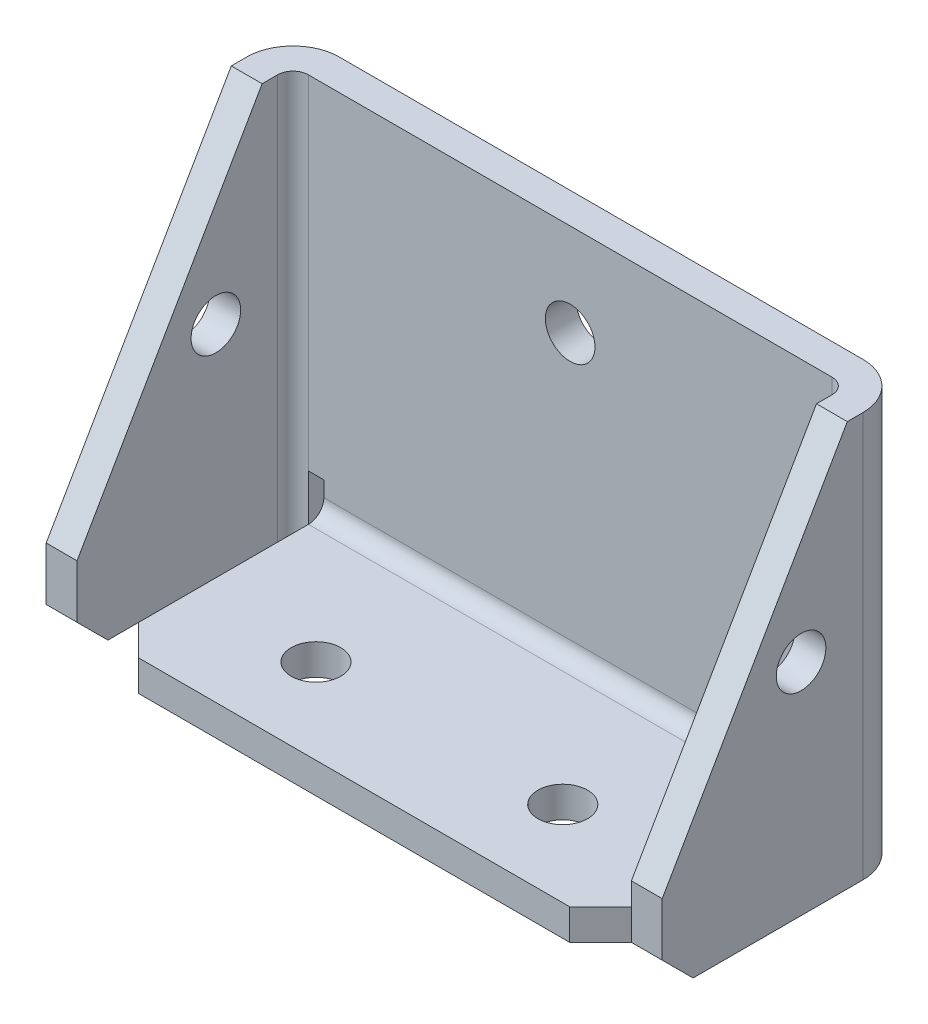
ISO-10303-21;
HEADER;
FILE_DESCRIPTION(('STEP AP214'),'2;1');
FILE_NAME('part.step','',(''),(''),'','','');
FILE_SCHEMA(('AUTOMOTIVE_DESIGN { 1 0 10303 214 1 1 1 1 }'));
ENDSEC;
DATA;
#1=APPLICATION_CONTEXT('core data for automotive mechanical design processes');
#2=APPLICATION_PROTOCOL_DEFINITION('international standard','automotive_design',2000,#1);
#3=PRODUCT_CONTEXT('',#1,'mechanical');
#4=PRODUCT('Part','Part','',(#3));
#5=PRODUCT_RELATED_PRODUCT_CATEGORY('part','',(#4));
#6=PRODUCT_DEFINITION_FORMATION('','',#4);
#7=PRODUCT_DEFINITION_CONTEXT('part definition',#1,'design');
#8=PRODUCT_DEFINITION('design','',#6,#7);
#9=PRODUCT_DEFINITION_SHAPE('','',#8);
#10=(LENGTH_UNIT() NAMED_UNIT(*) SI_UNIT(.MILLI.,.METRE.));
#11=(NAMED_UNIT(*) PLANE_ANGLE_UNIT() SI_UNIT($,.RADIAN.));
#12=(NAMED_UNIT(*) SI_UNIT($,.STERADIAN.) SOLID_ANGLE_UNIT());
#13=UNCERTAINTY_MEASURE_WITH_UNIT(LENGTH_MEASURE(1.E-05),#10,'distance_accuracy_value','');
#14=(GEOMETRIC_REPRESENTATION_CONTEXT(3) GLOBAL_UNCERTAINTY_ASSIGNED_CONTEXT((#13)) GLOBAL_UNIT_ASSIGNED_CONTEXT((#10,
#11,#12)) REPRESENTATION_CONTEXT('',''));
#15=CARTESIAN_POINT('',(0.,0.,0.));
#16=DIRECTION('',(0.,0.,1.));
#17=DIRECTION('',(1.,0.,0.));
#18=AXIS2_PLACEMENT_3D('',#15,#16,#17);
#19=CARTESIAN_POINT('',(0.,0.,0.));
#20=DIRECTION('',(0.,0.,1.));
#21=DIRECTION('',(1.,0.,0.));
#22=AXIS2_PLACEMENT_3D('',#19,#20,#21);
#23=PLANE('',#22);
#24=CARTESIAN_POINT('',(26.938605,32.131,0.));
#25=DIRECTION('',(0.,0.,1.));
#26=DIRECTION('',(1.,0.,0.));
#27=AXIS2_PLACEMENT_3D('',#24,#25,#26);
#28=CIRCLE('',#27,2.55269999999999);
#29=CARTESIAN_POINT('',(29.491305,32.131,0.));
#30=VERTEX_POINT('',#29);
#31=EDGE_CURVE('E520',#30,#30,#28,.T.);
#32=ORIENTED_EDGE('',*,*,#31,.F.);
#33=EDGE_LOOP('',(#32));
#34=FACE_BOUND('',#33,.T.);
#35=DIRECTION('',(-1.,0.,0.));
#36=VECTOR('',#35,1.);
#37=CARTESIAN_POINT('',(55.46471,41.656,0.));
#38=LINE('',#37,#36);
#39=CARTESIAN_POINT('',(53.87721,41.656,0.));
#40=VERTEX_POINT('',#39);
#41=CARTESIAN_POINT('',(0.,41.656,0.));
#42=VERTEX_POINT('',#41);
#43=EDGE_CURVE('E315',#40,#42,#38,.T.);
#44=ORIENTED_EDGE('',*,*,#43,.T.);
#45=DIRECTION('',(0.,-1.,0.));
#46=VECTOR('',#45,1.);
#47=CARTESIAN_POINT('',(0.,0.,0.));
#48=LINE('',#47,#46);
#49=CARTESIAN_POINT('',(0.,6.35,0.));
#50=VERTEX_POINT('',#49);
#51=EDGE_CURVE('E395',#42,#50,#48,.T.);
#52=ORIENTED_EDGE('',*,*,#51,.T.);
#53=DIRECTION('',(1.,0.,0.));
#54=VECTOR('',#53,1.);
#55=CARTESIAN_POINT('',(0.,6.35,0.));
#56=LINE('',#55,#54);
#57=CARTESIAN_POINT('',(1.5875,6.35,0.));
#58=VERTEX_POINT('',#57);
#59=EDGE_CURVE('E274',#50,#58,#56,.T.);
#60=ORIENTED_EDGE('',*,*,#59,.T.);
#61=DIRECTION('',(0.,-1.,0.));
#62=VECTOR('',#61,1.);
#63=CARTESIAN_POINT('',(1.5875,6.35,0.));
#64=LINE('',#63,#62);
#65=CARTESIAN_POINT('',(1.5875,4.7625,0.));
#66=VERTEX_POINT('',#65);
#67=EDGE_CURVE('E277',#58,#66,#64,.T.);
#68=ORIENTED_EDGE('',*,*,#67,.T.);
#69=DIRECTION('',(-1.,0.,0.));
#70=VECTOR('',#69,1.);
#71=CARTESIAN_POINT('',(0.,4.7625,0.));
#72=LINE('',#71,#70);
#73=CARTESIAN_POINT('',(52.28971,4.7625,0.));
#74=VERTEX_POINT('',#73);
#75=EDGE_CURVE('E459',#66,#74,#72,.F.);
#76=ORIENTED_EDGE('',*,*,#75,.T.);
#77=DIRECTION('',(0.,1.,0.));
#78=VECTOR('',#77,1.);
#79=CARTESIAN_POINT('',(52.28971,0.,0.));
#80=LINE('',#79,#78);
#81=CARTESIAN_POINT('',(52.28971,6.35,0.));
#82=VERTEX_POINT('',#81);
#83=EDGE_CURVE('E258',#74,#82,#80,.T.);
#84=ORIENTED_EDGE('',*,*,#83,.T.);
#85=DIRECTION('',(1.,0.,0.));
#86=VECTOR('',#85,1.);
#87=CARTESIAN_POINT('',(52.28971,6.35,0.));
#88=LINE('',#87,#86);
#89=CARTESIAN_POINT('',(53.87721,6.35,0.));
#90=VERTEX_POINT('',#89);
#91=EDGE_CURVE('E253',#82,#90,#88,.T.);
#92=ORIENTED_EDGE('',*,*,#91,.T.);
#93=DIRECTION('',(0.,1.,0.));
#94=VECTOR('',#93,1.);
#95=CARTESIAN_POINT('',(53.87721,41.656,0.));
#96=LINE('',#95,#94);
#97=EDGE_CURVE('E252',#90,#40,#96,.T.);
#98=ORIENTED_EDGE('',*,*,#97,.T.);
#99=EDGE_LOOP('',(#44,#52,#60,#68,#76,#84,#92,#98));
#100=FACE_BOUND('',#99,.T.);
#101=ADVANCED_FACE('F40',(#34,#100),#23,.T.);
#102=CARTESIAN_POINT('',(0.,0.,0.));
#103=DIRECTION('',(0.,-1.,0.));
#104=DIRECTION('',(0.,0.,-1.));
#105=AXIS2_PLACEMENT_3D('',#102,#103,#104);
#106=PLANE('',#105);
#107=DIRECTION('',(0.,0.,-1.));
#108=VECTOR('',#107,1.);
#109=CARTESIAN_POINT('',(53.87721,0.,22.226025));
#110=LINE('',#109,#108);
#111=CARTESIAN_POINT('',(53.87721,0.,0.));
#112=VERTEX_POINT('',#111);
#113=CARTESIAN_POINT('',(53.87721,0.,-3.175));
#114=VERTEX_POINT('',#113);
#115=EDGE_CURVE('E229',#112,#114,#110,.T.);
#116=ORIENTED_EDGE('',*,*,#115,.T.);
#117=CARTESIAN_POINT('',(53.87721,0.,1.5875));
#118=DIRECTION('',(0.,-1.,0.));
#119=DIRECTION('',(0.,0.,-1.));
#120=AXIS2_PLACEMENT_3D('',#117,#118,#119);
#121=CIRCLE('',#120,4.7625);
#122=CARTESIAN_POINT('',(58.63971,0.,1.58749999999999));
#123=VERTEX_POINT('',#122);
#124=EDGE_CURVE('E368',#114,#123,#121,.T.);
#125=ORIENTED_EDGE('',*,*,#124,.T.);
#126=DIRECTION('',(0.,0.,1.));
#127=VECTOR('',#126,1.);
#128=CARTESIAN_POINT('',(58.6397100000001,0.,22.225));
#129=LINE('',#128,#127);
#130=CARTESIAN_POINT('',(58.6397100000001,0.,19.05));
#131=VERTEX_POINT('',#130);
#132=EDGE_CURVE('E304',#123,#131,#129,.T.);
#133=ORIENTED_EDGE('',*,*,#132,.T.);
#134=DIRECTION('',(-1.,0.,0.));
#135=VECTOR('',#134,1.);
#136=CARTESIAN_POINT('',(55.4647100000001,0.,19.05));
#137=LINE('',#136,#135);
#138=CARTESIAN_POINT('',(55.46471,0.,19.05));
#139=VERTEX_POINT('',#138);
#140=EDGE_CURVE('E378',#131,#139,#137,.T.);
#141=ORIENTED_EDGE('',*,*,#140,.T.);
#142=DIRECTION('',(0.,0.,-1.));
#143=VECTOR('',#142,1.);
#144=CARTESIAN_POINT('',(55.46471,0.,0.));
#145=LINE('',#144,#143);
#146=CARTESIAN_POINT('',(55.46471,0.,1.58749999999999));
#147=VERTEX_POINT('',#146);
#148=EDGE_CURVE('E233',#139,#147,#145,.T.);
#149=ORIENTED_EDGE('',*,*,#148,.T.);
#150=CARTESIAN_POINT('',(53.87721,0.,1.5875));
#151=DIRECTION('',(0.,-1.,0.));
#152=DIRECTION('',(0.,0.,-1.));
#153=AXIS2_PLACEMENT_3D('',#150,#151,#152);
#154=CIRCLE('',#153,1.5875);
#155=EDGE_CURVE('E226',#147,#112,#154,.F.);
#156=ORIENTED_EDGE('',*,*,#155,.T.);
#157=EDGE_LOOP('',(#116,#125,#133,#141,#149,#156));
#158=FACE_BOUND('',#157,.T.);
#159=ADVANCED_FACE('F228',(#158),#106,.T.);
#160=CARTESIAN_POINT('',(14.238605,0.,13.462));
#161=DIRECTION('',(0.,1.,0.));
#162=DIRECTION('',(0.,0.,1.));
#163=AXIS2_PLACEMENT_3D('',#160,#161,#162);
#164=CIRCLE('',#163,2.55269999999998);
#165=CARTESIAN_POINT('',(14.238605,0.,16.0147));
#166=VERTEX_POINT('',#165);
#167=EDGE_CURVE('E1258',#166,#166,#164,.T.);
#168=ORIENTED_EDGE('',*,*,#167,.T.);
#169=EDGE_LOOP('',(#168));
#170=FACE_BOUND('',#169,.T.);
#171=CARTESIAN_POINT('',(39.638605,0.,13.462));
#172=DIRECTION('',(0.,1.,0.));
#173=DIRECTION('',(0.,0.,1.));
#174=AXIS2_PLACEMENT_3D('',#171,#172,#173);
#175=CIRCLE('',#174,2.55269999999998);
#176=CARTESIAN_POINT('',(39.638605,0.,16.0147));
#177=VERTEX_POINT('',#176);
#178=EDGE_CURVE('E1252',#177,#177,#175,.T.);
#179=ORIENTED_EDGE('',*,*,#178,.T.);
#180=EDGE_LOOP('',(#179));
#181=FACE_BOUND('',#180,.T.);
#182=DIRECTION('',(0.,0.,-1.));
#183=VECTOR('',#182,1.);
#184=CARTESIAN_POINT('',(1.5875,0.,22.226025));
#185=LINE('',#184,#183);
#186=CARTESIAN_POINT('',(1.5875,0.,19.05));
#187=VERTEX_POINT('',#186);
#188=CARTESIAN_POINT('',(1.5875,0.,1.58750000000001));
#189=VERTEX_POINT('',#188);
#190=EDGE_CURVE('E289',#187,#189,#185,.T.);
#191=ORIENTED_EDGE('',*,*,#190,.T.);
#192=DIRECTION('',(1.,0.,0.));
#193=VECTOR('',#192,1.);
#194=CARTESIAN_POINT('',(0.,0.,1.5875));
#195=LINE('',#194,#193);
#196=CARTESIAN_POINT('',(52.28971,0.,1.58750000000001));
#197=VERTEX_POINT('',#196);
#198=EDGE_CURVE('E407',#189,#197,#195,.T.);
#199=ORIENTED_EDGE('',*,*,#198,.T.);
#200=DIRECTION('',(0.,0.,-1.));
#201=VECTOR('',#200,1.);
#202=CARTESIAN_POINT('',(52.28971,0.,22.226025));
#203=LINE('',#202,#201);
#204=CARTESIAN_POINT('',(52.28971,0.,19.0499999999999));
#205=VERTEX_POINT('',#204);
#206=EDGE_CURVE('E247',#205,#197,#203,.T.);
#207=ORIENTED_EDGE('',*,*,#206,.F.);
#208=DIRECTION('',(0.707106781186544,0.,-0.707106781186551));
#209=VECTOR('',#208,1.);
#210=CARTESIAN_POINT('',(35.6698550000003,0.,35.6698549999999));
#211=LINE('',#210,#209);
#212=CARTESIAN_POINT('',(49.11471,0.,22.225));
#213=VERTEX_POINT('',#212);
#214=EDGE_CURVE('E433',#205,#213,#211,.F.);
#215=ORIENTED_EDGE('',*,*,#214,.T.);
#216=DIRECTION('',(1.,0.,0.));
#217=VECTOR('',#216,1.);
#218=CARTESIAN_POINT('',(52.28971,0.,22.225));
#219=LINE('',#218,#217);
#220=CARTESIAN_POINT('',(4.7625,0.,22.225));
#221=VERTEX_POINT('',#220);
#222=EDGE_CURVE('E428',#221,#213,#219,.T.);
#223=ORIENTED_EDGE('',*,*,#222,.F.);
#224=DIRECTION('',(0.707106781186544,0.,0.707106781186551));
#225=VECTOR('',#224,1.);
#226=CARTESIAN_POINT('',(-8.73124999999998,0.,8.7312499999999));
#227=LINE('',#226,#225);
#228=EDGE_CURVE('E426',#221,#187,#227,.F.);
#229=ORIENTED_EDGE('',*,*,#228,.T.);
#230=EDGE_LOOP('',(#191,#199,#207,#215,#223,#229));
#231=FACE_BOUND('',#230,.T.);
#232=ADVANCED_FACE('F424',(#170,#181,#231),#106,.T.);
#233=CARTESIAN_POINT('',(-1.58749999999999,0.,0.));
#234=DIRECTION('',(1.,0.,0.));
#235=DIRECTION('',(0.,0.,-1.));
#236=AXIS2_PLACEMENT_3D('',#233,#234,#235);
#237=PLANE('',#236);
#238=CARTESIAN_POINT('',(-1.58750000000002,22.606,7.93750000000019));
#239=DIRECTION('',(1.,0.,0.));
#240=DIRECTION('',(0.,0.,-1.));
#241=AXIS2_PLACEMENT_3D('',#238,#239,#240);
#242=CIRCLE('',#241,2.55269999999999);
#243=CARTESIAN_POINT('',(-1.58750000000001,22.606,5.38480000000019));
#244=VERTEX_POINT('',#243);
#245=EDGE_CURVE('E528',#244,#244,#242,.T.);
#246=ORIENTED_EDGE('',*,*,#245,.F.);
#247=EDGE_LOOP('',(#246));
#248=FACE_BOUND('',#247,.T.);
#249=DIRECTION('',(0.,0.,1.));
#250=VECTOR('',#249,1.);
#251=CARTESIAN_POINT('',(-1.58750000000007,0.,22.225));
#252=LINE('',#251,#250);
#253=CARTESIAN_POINT('',(-1.5875,0.,1.5875));
#254=VERTEX_POINT('',#253);
#255=CARTESIAN_POINT('',(-1.58750000000006,0.,19.05));
#256=VERTEX_POINT('',#255);
#257=EDGE_CURVE('E292',#254,#256,#252,.T.);
#258=ORIENTED_EDGE('',*,*,#257,.F.);
#259=DIRECTION('',(0.,-1.,0.));
#260=VECTOR('',#259,1.);
#261=CARTESIAN_POINT('',(-1.5875,41.656,1.58749999999999));
#262=LINE('',#261,#260);
#263=CARTESIAN_POINT('',(-1.58749999999999,41.656,1.58749999999999));
#264=VERTEX_POINT('',#263);
#265=EDGE_CURVE('E390',#254,#264,#262,.F.);
#266=ORIENTED_EDGE('',*,*,#265,.T.);
#267=DIRECTION('',(0.,0.,1.));
#268=VECTOR('',#267,1.);
#269=CARTESIAN_POINT('',(-1.58749999999999,41.656,0.));
#270=LINE('',#269,#268);
#271=CARTESIAN_POINT('',(-1.58749999999999,41.656,3.17499999999995));
#272=VERTEX_POINT('',#271);
#273=EDGE_CURVE('E319',#264,#272,#270,.T.);
#274=ORIENTED_EDGE('',*,*,#273,.T.);
#275=DIRECTION('',(0.,0.866025403784438,-0.500000000000001));
#276=VECTOR('',#275,1.);
#277=CARTESIAN_POINT('',(-1.58750000000001,41.656,3.17499999999996));
#278=LINE('',#277,#276);
#279=CARTESIAN_POINT('',(-1.58750000000007,8.66043211581293,22.225));
#280=VERTEX_POINT('',#279);
#281=EDGE_CURVE('E321',#272,#280,#278,.F.);
#282=ORIENTED_EDGE('',*,*,#281,.T.);
#283=DIRECTION('',(0.,1.,0.));
#284=VECTOR('',#283,1.);
#285=CARTESIAN_POINT('',(-1.58750000000007,0.,22.225));
#286=LINE('',#285,#284);
#287=CARTESIAN_POINT('',(-1.58750000000007,3.17500000000003,22.225));
#288=VERTEX_POINT('',#287);
#289=EDGE_CURVE('E313',#288,#280,#286,.T.);
#290=ORIENTED_EDGE('',*,*,#289,.F.);
#291=DIRECTION('',(0.,-0.707106781186552,-0.707106781186544));
#292=VECTOR('',#291,1.);
#293=CARTESIAN_POINT('',(-1.58750000000003,-9.525,9.52500000000011));
#294=LINE('',#293,#292);
#295=EDGE_CURVE('E381',#288,#256,#294,.T.);
#296=ORIENTED_EDGE('',*,*,#295,.T.);
#297=EDGE_LOOP('',(#258,#266,#274,#282,#290,#296));
#298=FACE_BOUND('',#297,.T.);
#299=ADVANCED_FACE('F499',(#248,#298),#237,.T.);
#300=CARTESIAN_POINT('',(55.46471,0.,-1.85031751825144E-13));
#301=DIRECTION('',(-1.,0.,0.));
#302=DIRECTION('',(0.,0.,1.));
#303=AXIS2_PLACEMENT_3D('',#300,#301,#302);
#304=PLANE('',#303);
#305=CARTESIAN_POINT('',(55.46471,22.606,7.93749999999999));
#306=DIRECTION('',(-1.,0.,0.));
#307=DIRECTION('',(0.,0.,1.));
#308=AXIS2_PLACEMENT_3D('',#305,#306,#307);
#309=CIRCLE('',#308,2.5527);
#310=CARTESIAN_POINT('',(55.46471,22.606,10.4902));
#311=VERTEX_POINT('',#310);
#312=EDGE_CURVE('E1243',#311,#311,#309,.T.);
#313=ORIENTED_EDGE('',*,*,#312,.F.);
#314=EDGE_LOOP('',(#313));
#315=FACE_BOUND('',#314,.T.);
#316=DIRECTION('',(0.,0.,1.));
#317=VECTOR('',#316,1.);
#318=CARTESIAN_POINT('',(55.46471,41.656,0.));
#319=LINE('',#318,#317);
#320=CARTESIAN_POINT('',(55.46471,41.656,1.58749999999999));
#321=VERTEX_POINT('',#320);
#322=CARTESIAN_POINT('',(55.46471,41.656,3.17499999999995));
#323=VERTEX_POINT('',#322);
#324=EDGE_CURVE('E318',#321,#323,#319,.T.);
#325=ORIENTED_EDGE('',*,*,#324,.F.);
#326=DIRECTION('',(0.,1.,0.));
#327=VECTOR('',#326,1.);
#328=CARTESIAN_POINT('',(55.46471,0.,1.58749999999999));
#329=LINE('',#328,#327);
#330=EDGE_CURVE('E387',#321,#147,#329,.F.);
#331=ORIENTED_EDGE('',*,*,#330,.T.);
#332=ORIENTED_EDGE('',*,*,#148,.F.);
#333=DIRECTION('',(0.,0.707106781186552,0.707106781186543));
#334=VECTOR('',#333,1.);
#335=CARTESIAN_POINT('',(55.46471,-9.52500000000009,9.52500000000002));
#336=LINE('',#335,#334);
#337=CARTESIAN_POINT('',(55.4647100000001,3.17500000000003,22.225));
#338=VERTEX_POINT('',#337);
#339=EDGE_CURVE('E380',#139,#338,#336,.T.);
#340=ORIENTED_EDGE('',*,*,#339,.T.);
#341=DIRECTION('',(0.,1.,0.));
#342=VECTOR('',#341,1.);
#343=CARTESIAN_POINT('',(55.4647100000001,0.,22.225));
#344=LINE('',#343,#342);
#345=CARTESIAN_POINT('',(55.4647100000001,8.66043211581293,22.225));
#346=VERTEX_POINT('',#345);
#347=EDGE_CURVE('E307',#338,#346,#344,.T.);
#348=ORIENTED_EDGE('',*,*,#347,.T.);
#349=DIRECTION('',(0.,0.866025403784438,-0.500000000000001));
#350=VECTOR('',#349,1.);
#351=CARTESIAN_POINT('',(55.4647100000001,8.66043211581293,22.225));
#352=LINE('',#351,#350);
#353=EDGE_CURVE('E945',#346,#323,#352,.T.);
#354=ORIENTED_EDGE('',*,*,#353,.T.);
#355=EDGE_LOOP('',(#325,#331,#332,#340,#348,#354));
#356=FACE_BOUND('',#355,.T.);
#357=ADVANCED_FACE('F385',(#315,#356),#304,.T.);
#358=CARTESIAN_POINT('',(-4.76249999999999,0.,0.));
#359=DIRECTION('',(1.,0.,0.));
#360=DIRECTION('',(0.,0.,-1.));
#361=AXIS2_PLACEMENT_3D('',#358,#359,#360);
#362=PLANE('',#361);
#363=CARTESIAN_POINT('',(-4.76250000000002,22.606,7.93750000000017));
#364=DIRECTION('',(1.,0.,0.));
#365=DIRECTION('',(0.,0.,-1.));
#366=AXIS2_PLACEMENT_3D('',#363,#364,#365);
#367=CIRCLE('',#366,2.55269999999999);
#368=CARTESIAN_POINT('',(-4.76250000000001,22.606,5.38480000000018));
#369=VERTEX_POINT('',#368);
#370=EDGE_CURVE('E524',#369,#369,#367,.T.);
#371=ORIENTED_EDGE('',*,*,#370,.T.);
#372=EDGE_LOOP('',(#371));
#373=FACE_BOUND('',#372,.T.);
#374=DIRECTION('',(0.,0.,-1.));
#375=VECTOR('',#374,1.);
#376=CARTESIAN_POINT('',(-4.76249999999999,41.656,0.));
#377=LINE('',#376,#375);
#378=CARTESIAN_POINT('',(-4.7625,41.656,1.58749999999998));
#379=VERTEX_POINT('',#378);
#380=CARTESIAN_POINT('',(-4.76250000000001,41.656,3.17499999999995));
#381=VERTEX_POINT('',#380);
#382=EDGE_CURVE('E333',#379,#381,#377,.F.);
#383=ORIENTED_EDGE('',*,*,#382,.F.);
#384=DIRECTION('',(0.,1.,0.));
#385=VECTOR('',#384,1.);
#386=CARTESIAN_POINT('',(-4.7625,0.,1.58749999999998));
#387=LINE('',#386,#385);
#388=CARTESIAN_POINT('',(-4.7625,0.,1.58749999999998));
#389=VERTEX_POINT('',#388);
#390=EDGE_CURVE('E48',#379,#389,#387,.F.);
#391=ORIENTED_EDGE('',*,*,#390,.T.);
#392=DIRECTION('',(0.,0.,-1.));
#393=VECTOR('',#392,1.);
#394=CARTESIAN_POINT('',(-4.76249999999998,0.,-3.175));
#395=LINE('',#394,#393);
#396=CARTESIAN_POINT('',(-4.76250000000006,0.,19.05));
#397=VERTEX_POINT('',#396);
#398=EDGE_CURVE('E302',#397,#389,#395,.T.);
#399=ORIENTED_EDGE('',*,*,#398,.F.);
#400=DIRECTION('',(0.,0.707106781186552,0.707106781186544));
#401=VECTOR('',#400,1.);
#402=CARTESIAN_POINT('',(-4.76250000000006,0.,19.05));
#403=LINE('',#402,#401);
#404=CARTESIAN_POINT('',(-4.76250000000007,3.17500000000003,22.225));
#405=VERTEX_POINT('',#404);
#406=EDGE_CURVE('E449',#397,#405,#403,.T.);
#407=ORIENTED_EDGE('',*,*,#406,.T.);
#408=DIRECTION('',(0.,1.,0.));
#409=VECTOR('',#408,1.);
#410=CARTESIAN_POINT('',(-4.76250000000007,0.,22.225));
#411=LINE('',#410,#409);
#412=CARTESIAN_POINT('',(-4.76250000000007,8.66043211581293,22.225));
#413=VERTEX_POINT('',#412);
#414=EDGE_CURVE('E311',#405,#413,#411,.T.);
#415=ORIENTED_EDGE('',*,*,#414,.T.);
#416=DIRECTION('',(0.,-0.866025403784438,0.500000000000001));
#417=VECTOR('',#416,1.);
#418=CARTESIAN_POINT('',(-4.76250000000001,41.656,3.17499999999995));
#419=LINE('',#418,#417);
#420=EDGE_CURVE('E337',#381,#413,#419,.T.);
#421=ORIENTED_EDGE('',*,*,#420,.F.);
#422=EDGE_LOOP('',(#383,#391,#399,#407,#415,#421));
#423=FACE_BOUND('',#422,.T.);
#424=ADVANCED_FACE('F483',(#373,#423),#362,.F.);
#425=CARTESIAN_POINT('',(58.63971,0.,-1.96117205075971E-13));
#426=DIRECTION('',(-1.,0.,0.));
#427=DIRECTION('',(0.,0.,1.));
#428=AXIS2_PLACEMENT_3D('',#425,#426,#427);
#429=PLANE('',#428);
#430=CARTESIAN_POINT('',(58.63971,22.606,7.93749999999998));
#431=DIRECTION('',(1.,0.,0.));
#432=DIRECTION('',(0.,0.,-1.));
#433=AXIS2_PLACEMENT_3D('',#430,#431,#432);
#434=CIRCLE('',#433,2.55269999999999);
#435=CARTESIAN_POINT('',(58.63971,22.606,5.38479999999999));
#436=VERTEX_POINT('',#435);
#437=EDGE_CURVE('E527',#436,#436,#434,.T.);
#438=ORIENTED_EDGE('',*,*,#437,.F.);
#439=EDGE_LOOP('',(#438));
#440=FACE_BOUND('',#439,.T.);
#441=ORIENTED_EDGE('',*,*,#132,.F.);
#442=DIRECTION('',(0.,-1.,0.));
#443=VECTOR('',#442,1.);
#444=CARTESIAN_POINT('',(58.63971,41.656,1.58749999999998));
#445=LINE('',#444,#443);
#446=CARTESIAN_POINT('',(58.63971,41.656,1.58749999999998));
#447=VERTEX_POINT('',#446);
#448=EDGE_CURVE('E339',#123,#447,#445,.F.);
#449=ORIENTED_EDGE('',*,*,#448,.T.);
#450=DIRECTION('',(0.,0.,-1.));
#451=VECTOR('',#450,1.);
#452=CARTESIAN_POINT('',(58.63971,41.656,22.225));
#453=LINE('',#452,#451);
#454=CARTESIAN_POINT('',(58.63971,41.656,3.17499999999995));
#455=VERTEX_POINT('',#454);
#456=EDGE_CURVE('E347',#447,#455,#453,.F.);
#457=ORIENTED_EDGE('',*,*,#456,.T.);
#458=DIRECTION('',(0.,0.866025403784438,-0.500000000000001));
#459=VECTOR('',#458,1.);
#460=CARTESIAN_POINT('',(58.6397100000001,8.66043211581292,22.225));
#461=LINE('',#460,#459);
#462=CARTESIAN_POINT('',(58.6397100000001,8.66043211581293,22.225));
#463=VERTEX_POINT('',#462);
#464=EDGE_CURVE('E327',#463,#455,#461,.T.);
#465=ORIENTED_EDGE('',*,*,#464,.F.);
#466=DIRECTION('',(0.,1.,0.));
#467=VECTOR('',#466,1.);
#468=CARTESIAN_POINT('',(58.6397100000001,0.,22.225));
#469=LINE('',#468,#467);
#470=CARTESIAN_POINT('',(58.6397100000001,3.17500000000003,22.225));
#471=VERTEX_POINT('',#470);
#472=EDGE_CURVE('E309',#471,#463,#469,.T.);
#473=ORIENTED_EDGE('',*,*,#472,.F.);
#474=DIRECTION('',(0.,-0.707106781186552,-0.707106781186543));
#475=VECTOR('',#474,1.);
#476=CARTESIAN_POINT('',(58.6397100000001,0.,19.05));
#477=LINE('',#476,#475);
#478=EDGE_CURVE('E376',#471,#131,#477,.T.);
#479=ORIENTED_EDGE('',*,*,#478,.T.);
#480=EDGE_LOOP('',(#441,#449,#457,#465,#473,#479));
#481=FACE_BOUND('',#480,.T.);
#482=ADVANCED_FACE('F371',(#440,#481),#429,.F.);
#483=CARTESIAN_POINT('',(0.,0.,-3.175));
#484=DIRECTION('',(0.,0.,-1.));
#485=DIRECTION('',(-1.,0.,0.));
#486=AXIS2_PLACEMENT_3D('',#483,#484,#485);
#487=PLANE('',#486);
#488=CARTESIAN_POINT('',(26.938605,32.131,-3.175));
#489=DIRECTION('',(0.,0.,-1.));
#490=DIRECTION('',(-1.,0.,0.));
#491=AXIS2_PLACEMENT_3D('',#488,#489,#490);
#492=CIRCLE('',#491,2.55269999999999);
#493=CARTESIAN_POINT('',(24.385905,32.131,-3.175));
#494=VERTEX_POINT('',#493);
#495=EDGE_CURVE('E523',#494,#494,#492,.T.);
#496=ORIENTED_EDGE('',*,*,#495,.F.);
#497=EDGE_LOOP('',(#496));
#498=FACE_BOUND('',#497,.T.);
#499=DIRECTION('',(0.,1.,0.));
#500=VECTOR('',#499,1.);
#501=CARTESIAN_POINT('',(52.28971,0.,-3.175));
#502=LINE('',#501,#500);
#503=CARTESIAN_POINT('',(52.28971,4.7625,-3.175));
#504=VERTEX_POINT('',#503);
#505=CARTESIAN_POINT('',(52.28971,6.35,-3.175));
#506=VERTEX_POINT('',#505);
#507=EDGE_CURVE('E255',#504,#506,#502,.T.);
#508=ORIENTED_EDGE('',*,*,#507,.F.);
#509=DIRECTION('',(1.,0.,0.));
#510=VECTOR('',#509,1.);
#511=CARTESIAN_POINT('',(0.,4.7625,-3.175));
#512=LINE('',#511,#510);
#513=CARTESIAN_POINT('',(1.5875,4.7625,-3.175));
#514=VERTEX_POINT('',#513);
#515=EDGE_CURVE('E360',#504,#514,#512,.F.);
#516=ORIENTED_EDGE('',*,*,#515,.T.);
#517=DIRECTION('',(0.,-1.,0.));
#518=VECTOR('',#517,1.);
#519=CARTESIAN_POINT('',(1.5875,6.35,-3.175));
#520=LINE('',#519,#518);
#521=CARTESIAN_POINT('',(1.5875,6.35,-3.175));
#522=VERTEX_POINT('',#521);
#523=EDGE_CURVE('E280',#522,#514,#520,.T.);
#524=ORIENTED_EDGE('',*,*,#523,.F.);
#525=DIRECTION('',(1.,0.,0.));
#526=VECTOR('',#525,1.);
#527=CARTESIAN_POINT('',(0.,6.35,-3.175));
#528=LINE('',#527,#526);
#529=CARTESIAN_POINT('',(0.,6.35,-3.175));
#530=VERTEX_POINT('',#529);
#531=EDGE_CURVE('E286',#530,#522,#528,.T.);
#532=ORIENTED_EDGE('',*,*,#531,.F.);
#533=DIRECTION('',(0.,1.,0.));
#534=VECTOR('',#533,1.);
#535=CARTESIAN_POINT('',(0.,41.656,-3.175));
#536=LINE('',#535,#534);
#537=CARTESIAN_POINT('',(0.,41.656,-3.175));
#538=VERTEX_POINT('',#537);
#539=EDGE_CURVE('E358',#530,#538,#536,.T.);
#540=ORIENTED_EDGE('',*,*,#539,.T.);
#541=DIRECTION('',(-1.,0.,0.));
#542=VECTOR('',#541,1.);
#543=CARTESIAN_POINT('',(0.,41.656,-3.175));
#544=LINE('',#543,#542);
#545=CARTESIAN_POINT('',(53.87721,41.656,-3.175));
#546=VERTEX_POINT('',#545);
#547=EDGE_CURVE('E322',#538,#546,#544,.F.);
#548=ORIENTED_EDGE('',*,*,#547,.T.);
#549=DIRECTION('',(0.,-1.,0.));
#550=VECTOR('',#549,1.);
#551=CARTESIAN_POINT('',(53.87721,0.,-3.175));
#552=LINE('',#551,#550);
#553=CARTESIAN_POINT('',(53.87721,6.35,-3.175));
#554=VERTEX_POINT('',#553);
#555=EDGE_CURVE('E356',#546,#554,#552,.T.);
#556=ORIENTED_EDGE('',*,*,#555,.T.);
#557=DIRECTION('',(1.,0.,0.));
#558=VECTOR('',#557,1.);
#559=CARTESIAN_POINT('',(52.28971,6.35,-3.175));
#560=LINE('',#559,#558);
#561=EDGE_CURVE('E248',#506,#554,#560,.T.);
#562=ORIENTED_EDGE('',*,*,#561,.F.);
#563=EDGE_LOOP('',(#508,#516,#524,#532,#540,#548,#556,#562));
#564=FACE_BOUND('',#563,.T.);
#565=ADVANCED_FACE('F354',(#498,#564),#487,.T.);
#566=CARTESIAN_POINT('',(-4.76250000000001,41.656,3.17499999999995));
#567=DIRECTION('',(0.,-0.500000000000001,-0.866025403784438));
#568=DIRECTION('',(0.,0.866025403784438,-0.500000000000001));
#569=AXIS2_PLACEMENT_3D('',#566,#567,#568);
#570=PLANE('',#569);
#571=DIRECTION('',(-1.,0.,0.));
#572=VECTOR('',#571,1.);
#573=CARTESIAN_POINT('',(-4.76250000000007,8.66043211581293,22.225));
#574=LINE('',#573,#572);
#575=EDGE_CURVE('E493',#413,#280,#574,.F.);
#576=ORIENTED_EDGE('',*,*,#575,.T.);
#577=ORIENTED_EDGE('',*,*,#281,.F.);
#578=DIRECTION('',(1.,0.,0.));
#579=VECTOR('',#578,1.);
#580=CARTESIAN_POINT('',(-4.76249999999999,41.656,3.17499999999996));
#581=LINE('',#580,#579);
#582=EDGE_CURVE('E511',#272,#381,#581,.F.);
#583=ORIENTED_EDGE('',*,*,#582,.T.);
#584=ORIENTED_EDGE('',*,*,#420,.T.);
#585=EDGE_LOOP('',(#576,#577,#583,#584));
#586=FACE_BOUND('',#585,.T.);
#587=ADVANCED_FACE('F509',(#586),#570,.F.);
#588=CARTESIAN_POINT('',(58.6397100000001,8.66043211581292,22.225));
#589=DIRECTION('',(0.,-0.500000000000001,-0.866025403784438));
#590=DIRECTION('',(0.,0.866025403784438,-0.500000000000001));
#591=AXIS2_PLACEMENT_3D('',#588,#589,#590);
#592=PLANE('',#591);
#593=DIRECTION('',(1.,0.,0.));
#594=VECTOR('',#593,1.);
#595=CARTESIAN_POINT('',(58.6397100000001,41.656,3.17499999999995));
#596=LINE('',#595,#594);
#597=EDGE_CURVE('E338',#323,#455,#596,.T.);
#598=ORIENTED_EDGE('',*,*,#597,.F.);
#599=ORIENTED_EDGE('',*,*,#353,.F.);
#600=DIRECTION('',(1.,0.,0.));
#601=VECTOR('',#600,1.);
#602=CARTESIAN_POINT('',(58.6397100000001,8.66043211581292,22.225));
#603=LINE('',#602,#601);
#604=EDGE_CURVE('E330',#463,#346,#603,.F.);
#605=ORIENTED_EDGE('',*,*,#604,.F.);
#606=ORIENTED_EDGE('',*,*,#464,.T.);
#607=EDGE_LOOP('',(#598,#599,#605,#606));
#608=FACE_BOUND('',#607,.T.);
#609=ADVANCED_FACE('F578',(#608),#592,.F.);
#610=CARTESIAN_POINT('',(0.,41.656,-3.175));
#611=DIRECTION('',(0.,1.,0.));
#612=DIRECTION('',(0.,0.,1.));
#613=AXIS2_PLACEMENT_3D('',#610,#611,#612);
#614=PLANE('',#613);
#615=ORIENTED_EDGE('',*,*,#456,.F.);
#616=CARTESIAN_POINT('',(53.87721,41.656,1.5875));
#617=DIRECTION('',(0.,1.,0.));
#618=DIRECTION('',(0.,0.,1.));
#619=AXIS2_PLACEMENT_3D('',#616,#617,#618);
#620=CIRCLE('',#619,4.7625);
#621=EDGE_CURVE('E342',#447,#546,#620,.T.);
#622=ORIENTED_EDGE('',*,*,#621,.T.);
#623=ORIENTED_EDGE('',*,*,#547,.F.);
#624=CARTESIAN_POINT('',(0.,41.656,1.5875));
#625=DIRECTION('',(0.,1.,0.));
#626=DIRECTION('',(0.,0.,1.));
#627=AXIS2_PLACEMENT_3D('',#624,#625,#626);
#628=CIRCLE('',#627,4.7625);
#629=EDGE_CURVE('E62',#538,#379,#628,.T.);
#630=ORIENTED_EDGE('',*,*,#629,.T.);
#631=ORIENTED_EDGE('',*,*,#382,.T.);
#632=ORIENTED_EDGE('',*,*,#582,.F.);
#633=ORIENTED_EDGE('',*,*,#273,.F.);
#634=CARTESIAN_POINT('',(0.,41.656,1.5875));
#635=DIRECTION('',(0.,1.,0.));
#636=DIRECTION('',(0.,0.,1.));
#637=AXIS2_PLACEMENT_3D('',#634,#635,#636);
#638=CIRCLE('',#637,1.5875);
#639=EDGE_CURVE('E401',#264,#42,#638,.F.);
#640=ORIENTED_EDGE('',*,*,#639,.T.);
#641=ORIENTED_EDGE('',*,*,#43,.F.);
#642=CARTESIAN_POINT('',(53.87721,41.656,1.5875));
#643=DIRECTION('',(0.,1.,0.));
#644=DIRECTION('',(0.,0.,1.));
#645=AXIS2_PLACEMENT_3D('',#642,#643,#644);
#646=CIRCLE('',#645,1.5875);
#647=EDGE_CURVE('E238',#40,#321,#646,.F.);
#648=ORIENTED_EDGE('',*,*,#647,.T.);
#649=ORIENTED_EDGE('',*,*,#324,.T.);
#650=ORIENTED_EDGE('',*,*,#597,.T.);
#651=EDGE_LOOP('',(#615,#622,#623,#630,#631,#632,#633,#640,#641,#648,#649,#650));
#652=FACE_BOUND('',#651,.T.);
#653=ADVANCED_FACE('F345',(#652),#614,.T.);
#654=CARTESIAN_POINT('',(-4.76250000000007,0.,22.225));
#655=DIRECTION('',(0.,0.,-1.));
#656=DIRECTION('',(-1.,0.,0.));
#657=AXIS2_PLACEMENT_3D('',#654,#655,#656);
#658=PLANE('',#657);
#659=ORIENTED_EDGE('',*,*,#414,.F.);
#660=DIRECTION('',(1.,0.,0.));
#661=VECTOR('',#660,1.);
#662=CARTESIAN_POINT('',(-1.58750000000007,3.17500000000003,22.225));
#663=LINE('',#662,#661);
#664=EDGE_CURVE('E451',#405,#288,#663,.T.);
#665=ORIENTED_EDGE('',*,*,#664,.T.);
#666=ORIENTED_EDGE('',*,*,#289,.T.);
#667=ORIENTED_EDGE('',*,*,#575,.F.);
#668=EDGE_LOOP('',(#659,#665,#666,#667));
#669=FACE_BOUND('',#668,.T.);
#670=ADVANCED_FACE('F490',(#669),#658,.F.);
#671=CARTESIAN_POINT('',(55.4647100000001,0.,22.225));
#672=DIRECTION('',(0.,0.,-1.));
#673=DIRECTION('',(-1.,0.,0.));
#674=AXIS2_PLACEMENT_3D('',#671,#672,#673);
#675=PLANE('',#674);
#676=ORIENTED_EDGE('',*,*,#347,.F.);
#677=DIRECTION('',(1.,0.,0.));
#678=VECTOR('',#677,1.);
#679=CARTESIAN_POINT('',(58.6397100000001,3.17500000000003,22.225));
#680=LINE('',#679,#678);
#681=EDGE_CURVE('E456',#338,#471,#680,.T.);
#682=ORIENTED_EDGE('',*,*,#681,.T.);
#683=ORIENTED_EDGE('',*,*,#472,.T.);
#684=ORIENTED_EDGE('',*,*,#604,.T.);
#685=EDGE_LOOP('',(#676,#682,#683,#684));
#686=FACE_BOUND('',#685,.T.);
#687=ADVANCED_FACE('F693',(#686),#675,.F.);
#688=ORIENTED_EDGE('',*,*,#398,.T.);
#689=CARTESIAN_POINT('',(0.,0.,1.5875));
#690=DIRECTION('',(0.,-1.,0.));
#691=DIRECTION('',(0.,0.,-1.));
#692=AXIS2_PLACEMENT_3D('',#689,#690,#691);
#693=CIRCLE('',#692,4.7625);
#694=CARTESIAN_POINT('',(0.,0.,-3.175));
#695=VERTEX_POINT('',#694);
#696=EDGE_CURVE('E12',#389,#695,#693,.T.);
#697=ORIENTED_EDGE('',*,*,#696,.T.);
#698=DIRECTION('',(0.,0.,-1.));
#699=VECTOR('',#698,1.);
#700=CARTESIAN_POINT('',(0.,0.,22.226025));
#701=LINE('',#700,#699);
#702=CARTESIAN_POINT('',(0.,0.,0.));
#703=VERTEX_POINT('',#702);
#704=EDGE_CURVE('E296',#703,#695,#701,.T.);
#705=ORIENTED_EDGE('',*,*,#704,.F.);
#706=CARTESIAN_POINT('',(0.,0.,1.5875));
#707=DIRECTION('',(0.,-1.,0.));
#708=DIRECTION('',(0.,0.,-1.));
#709=AXIS2_PLACEMENT_3D('',#706,#707,#708);
#710=CIRCLE('',#709,1.5875);
#711=EDGE_CURVE('E393',#703,#254,#710,.F.);
#712=ORIENTED_EDGE('',*,*,#711,.T.);
#713=ORIENTED_EDGE('',*,*,#257,.T.);
#714=DIRECTION('',(-1.,0.,0.));
#715=VECTOR('',#714,1.);
#716=CARTESIAN_POINT('',(-4.76250000000006,0.,19.05));
#717=LINE('',#716,#715);
#718=EDGE_CURVE('E446',#256,#397,#717,.T.);
#719=ORIENTED_EDGE('',*,*,#718,.T.);
#720=EDGE_LOOP('',(#688,#697,#705,#712,#713,#719));
#721=FACE_BOUND('',#720,.T.);
#722=ADVANCED_FACE('F480',(#721),#106,.T.);
#723=CARTESIAN_POINT('',(1.5875,6.35,22.226025));
#724=DIRECTION('',(1.,0.,0.));
#725=DIRECTION('',(0.,1.,0.));
#726=AXIS2_PLACEMENT_3D('',#723,#724,#725);
#727=PLANE('',#726);
#728=ORIENTED_EDGE('',*,*,#523,.T.);
#729=CARTESIAN_POINT('',(1.5875,4.7625,1.5875));
#730=DIRECTION('',(1.,0.,0.));
#731=DIRECTION('',(0.,1.,0.));
#732=AXIS2_PLACEMENT_3D('',#729,#730,#731);
#733=CIRCLE('',#732,4.7625);
#734=EDGE_CURVE('E362',#514,#189,#733,.F.);
#735=ORIENTED_EDGE('',*,*,#734,.T.);
#736=ORIENTED_EDGE('',*,*,#190,.F.);
#737=DIRECTION('',(0.,1.,0.));
#738=VECTOR('',#737,1.);
#739=CARTESIAN_POINT('',(1.5875,6.35,19.05));
#740=LINE('',#739,#738);
#741=CARTESIAN_POINT('',(1.5875,3.175,19.05));
#742=VERTEX_POINT('',#741);
#743=EDGE_CURVE('E432',#187,#742,#740,.T.);
#744=ORIENTED_EDGE('',*,*,#743,.T.);
#745=DIRECTION('',(0.,0.,-1.));
#746=VECTOR('',#745,1.);
#747=CARTESIAN_POINT('',(1.5875,3.175,22.225));
#748=LINE('',#747,#746);
#749=CARTESIAN_POINT('',(1.5875,3.175,1.5875));
#750=VERTEX_POINT('',#749);
#751=EDGE_CURVE('E543',#742,#750,#748,.T.);
#752=ORIENTED_EDGE('',*,*,#751,.T.);
#753=CARTESIAN_POINT('',(1.5875,4.7625,1.5875));
#754=DIRECTION('',(1.,0.,0.));
#755=DIRECTION('',(0.,1.,0.));
#756=AXIS2_PLACEMENT_3D('',#753,#754,#755);
#757=CIRCLE('',#756,1.5875);
#758=EDGE_CURVE('E237',#750,#66,#757,.T.);
#759=ORIENTED_EDGE('',*,*,#758,.T.);
#760=ORIENTED_EDGE('',*,*,#67,.F.);
#761=DIRECTION('',(0.,0.,-1.));
#762=VECTOR('',#761,1.);
#763=CARTESIAN_POINT('',(1.5875,6.35,22.226025));
#764=LINE('',#763,#762);
#765=EDGE_CURVE('E290',#58,#522,#764,.T.);
#766=ORIENTED_EDGE('',*,*,#765,.T.);
#767=EDGE_LOOP('',(#728,#735,#736,#744,#752,#759,#760,#766));
#768=FACE_BOUND('',#767,.T.);
#769=ADVANCED_FACE('F421',(#768),#727,.F.);
#770=CARTESIAN_POINT('',(0.,6.35,22.226025));
#771=DIRECTION('',(0.,1.,0.));
#772=DIRECTION('',(-1.,0.,0.));
#773=AXIS2_PLACEMENT_3D('',#770,#771,#772);
#774=PLANE('',#773);
#775=DIRECTION('',(0.,0.,-1.));
#776=VECTOR('',#775,1.);
#777=CARTESIAN_POINT('',(0.,6.35,22.226025));
#778=LINE('',#777,#776);
#779=EDGE_CURVE('E293',#50,#530,#778,.T.);
#780=ORIENTED_EDGE('',*,*,#779,.T.);
#781=ORIENTED_EDGE('',*,*,#531,.T.);
#782=ORIENTED_EDGE('',*,*,#765,.F.);
#783=ORIENTED_EDGE('',*,*,#59,.F.);
#784=EDGE_LOOP('',(#780,#781,#782,#783));
#785=FACE_BOUND('',#784,.T.);
#786=ADVANCED_FACE('F472',(#785),#774,.F.);
#787=CARTESIAN_POINT('',(0.,0.,22.226025));
#788=DIRECTION('',(-1.,0.,0.));
#789=DIRECTION('',(0.,-1.,0.));
#790=AXIS2_PLACEMENT_3D('',#787,#788,#789);
#791=PLANE('',#790);
#792=ORIENTED_EDGE('',*,*,#704,.T.);
#793=DIRECTION('',(0.,1.,0.));
#794=VECTOR('',#793,1.);
#795=CARTESIAN_POINT('',(0.,0.,-3.175));
#796=LINE('',#795,#794);
#797=EDGE_CURVE('E283',#695,#530,#796,.T.);
#798=ORIENTED_EDGE('',*,*,#797,.T.);
#799=ORIENTED_EDGE('',*,*,#779,.F.);
#800=DIRECTION('',(0.,1.,0.));
#801=VECTOR('',#800,1.);
#802=CARTESIAN_POINT('',(0.,0.,0.));
#803=LINE('',#802,#801);
#804=EDGE_CURVE('E267',#703,#50,#803,.T.);
#805=ORIENTED_EDGE('',*,*,#804,.F.);
#806=EDGE_LOOP('',(#792,#798,#799,#805));
#807=FACE_BOUND('',#806,.T.);
#808=ADVANCED_FACE('F474',(#807),#791,.F.);
#809=CARTESIAN_POINT('',(53.87721,6.35,22.226025));
#810=DIRECTION('',(1.,0.,0.));
#811=DIRECTION('',(0.,0.,-1.));
#812=AXIS2_PLACEMENT_3D('',#809,#810,#811);
#813=PLANE('',#812);
#814=DIRECTION('',(0.,0.,-1.));
#815=VECTOR('',#814,1.);
#816=CARTESIAN_POINT('',(53.87721,6.35,22.226025));
#817=LINE('',#816,#815);
#818=EDGE_CURVE('E265',#90,#554,#817,.T.);
#819=ORIENTED_EDGE('',*,*,#818,.T.);
#820=DIRECTION('',(0.,-1.,0.));
#821=VECTOR('',#820,1.);
#822=CARTESIAN_POINT('',(53.87721,6.35,-3.175));
#823=LINE('',#822,#821);
#824=EDGE_CURVE('E246',#554,#114,#823,.T.);
#825=ORIENTED_EDGE('',*,*,#824,.T.);
#826=ORIENTED_EDGE('',*,*,#115,.F.);
#827=DIRECTION('',(0.,-1.,0.));
#828=VECTOR('',#827,1.);
#829=CARTESIAN_POINT('',(53.87721,6.35,0.));
#830=LINE('',#829,#828);
#831=EDGE_CURVE('E244',#90,#112,#830,.T.);
#832=ORIENTED_EDGE('',*,*,#831,.F.);
#833=EDGE_LOOP('',(#819,#825,#826,#832));
#834=FACE_BOUND('',#833,.T.);
#835=ADVANCED_FACE('F243',(#834),#813,.F.);
#836=CARTESIAN_POINT('',(52.28971,6.35,22.226025));
#837=DIRECTION('',(0.,1.,0.));
#838=DIRECTION('',(-1.,0.,0.));
#839=AXIS2_PLACEMENT_3D('',#836,#837,#838);
#840=PLANE('',#839);
#841=DIRECTION('',(0.,0.,-1.));
#842=VECTOR('',#841,1.);
#843=CARTESIAN_POINT('',(52.28971,6.35,22.226025));
#844=LINE('',#843,#842);
#845=EDGE_CURVE('E268',#82,#506,#844,.T.);
#846=ORIENTED_EDGE('',*,*,#845,.T.);
#847=ORIENTED_EDGE('',*,*,#561,.T.);
#848=ORIENTED_EDGE('',*,*,#818,.F.);
#849=ORIENTED_EDGE('',*,*,#91,.F.);
#850=EDGE_LOOP('',(#846,#847,#848,#849));
#851=FACE_BOUND('',#850,.T.);
#852=ADVANCED_FACE('F555',(#851),#840,.F.);
#853=CARTESIAN_POINT('',(52.28971,0.,22.226025));
#854=DIRECTION('',(-1.,0.,0.));
#855=DIRECTION('',(0.,-1.,0.));
#856=AXIS2_PLACEMENT_3D('',#853,#854,#855);
#857=PLANE('',#856);
#858=ORIENTED_EDGE('',*,*,#206,.T.);
#859=CARTESIAN_POINT('',(52.28971,4.7625,1.5875));
#860=DIRECTION('',(-1.,0.,0.));
#861=DIRECTION('',(0.,-1.,0.));
#862=AXIS2_PLACEMENT_3D('',#859,#860,#861);
#863=CIRCLE('',#862,4.7625);
#864=EDGE_CURVE('E364',#197,#504,#863,.F.);
#865=ORIENTED_EDGE('',*,*,#864,.T.);
#866=ORIENTED_EDGE('',*,*,#507,.T.);
#867=ORIENTED_EDGE('',*,*,#845,.F.);
#868=ORIENTED_EDGE('',*,*,#83,.F.);
#869=CARTESIAN_POINT('',(52.28971,4.7625,1.5875));
#870=DIRECTION('',(-1.,0.,0.));
#871=DIRECTION('',(0.,-1.,0.));
#872=AXIS2_PLACEMENT_3D('',#869,#870,#871);
#873=CIRCLE('',#872,1.5875);
#874=CARTESIAN_POINT('',(52.28971,3.175,1.5875));
#875=VERTEX_POINT('',#874);
#876=EDGE_CURVE('E405',#74,#875,#873,.T.);
#877=ORIENTED_EDGE('',*,*,#876,.T.);
#878=DIRECTION('',(0.,0.,-1.));
#879=VECTOR('',#878,1.);
#880=CARTESIAN_POINT('',(52.28971,3.175,22.225));
#881=LINE('',#880,#879);
#882=CARTESIAN_POINT('',(52.28971,3.175,19.0499999999999));
#883=VERTEX_POINT('',#882);
#884=EDGE_CURVE('E545',#883,#875,#881,.T.);
#885=ORIENTED_EDGE('',*,*,#884,.F.);
#886=DIRECTION('',(0.,-1.,0.));
#887=VECTOR('',#886,1.);
#888=CARTESIAN_POINT('',(52.28971,0.,19.0499999999999));
#889=LINE('',#888,#887);
#890=EDGE_CURVE('E444',#883,#205,#889,.T.);
#891=ORIENTED_EDGE('',*,*,#890,.T.);
#892=EDGE_LOOP('',(#858,#865,#866,#867,#868,#877,#885,#891));
#893=FACE_BOUND('',#892,.T.);
#894=ADVANCED_FACE('F410',(#893),#857,.F.);
#895=CARTESIAN_POINT('',(1.5875,3.175,22.225));
#896=DIRECTION('',(0.,-1.,0.));
#897=DIRECTION('',(0.,0.,-1.));
#898=AXIS2_PLACEMENT_3D('',#895,#896,#897);
#899=PLANE('',#898);
#900=CARTESIAN_POINT('',(14.238605,3.175,13.462));
#901=DIRECTION('',(0.,1.,0.));
#902=DIRECTION('',(0.,0.,1.));
#903=AXIS2_PLACEMENT_3D('',#900,#901,#902);
#904=CIRCLE('',#903,2.55269999999998);
#905=CARTESIAN_POINT('',(14.238605,3.175,16.0147));
#906=VERTEX_POINT('',#905);
#907=EDGE_CURVE('E1261',#906,#906,#904,.T.);
#908=ORIENTED_EDGE('',*,*,#907,.F.);
#909=EDGE_LOOP('',(#908));
#910=FACE_BOUND('',#909,.T.);
#911=CARTESIAN_POINT('',(39.638605,3.175,13.462));
#912=DIRECTION('',(0.,1.,0.));
#913=DIRECTION('',(0.,0.,1.));
#914=AXIS2_PLACEMENT_3D('',#911,#912,#913);
#915=CIRCLE('',#914,2.55269999999998);
#916=CARTESIAN_POINT('',(39.638605,3.175,16.0147));
#917=VERTEX_POINT('',#916);
#918=EDGE_CURVE('E1255',#917,#917,#915,.T.);
#919=ORIENTED_EDGE('',*,*,#918,.F.);
#920=EDGE_LOOP('',(#919));
#921=FACE_BOUND('',#920,.T.);
#922=ORIENTED_EDGE('',*,*,#884,.T.);
#923=DIRECTION('',(-1.,0.,0.));
#924=VECTOR('',#923,1.);
#925=CARTESIAN_POINT('',(1.5875,3.175,1.5875));
#926=LINE('',#925,#924);
#927=EDGE_CURVE('E389',#875,#750,#926,.T.);
#928=ORIENTED_EDGE('',*,*,#927,.T.);
#929=ORIENTED_EDGE('',*,*,#751,.F.);
#930=DIRECTION('',(-0.707106781186544,0.,-0.707106781186551));
#931=VECTOR('',#930,1.);
#932=CARTESIAN_POINT('',(4.7625,3.175,22.225));
#933=LINE('',#932,#931);
#934=CARTESIAN_POINT('',(4.7625,3.175,22.225));
#935=VERTEX_POINT('',#934);
#936=EDGE_CURVE('E442',#742,#935,#933,.F.);
#937=ORIENTED_EDGE('',*,*,#936,.T.);
#938=DIRECTION('',(-1.,0.,0.));
#939=VECTOR('',#938,1.);
#940=CARTESIAN_POINT('',(1.5875,3.175,22.225));
#941=LINE('',#940,#939);
#942=CARTESIAN_POINT('',(49.11471,3.175,22.225));
#943=VERTEX_POINT('',#942);
#944=EDGE_CURVE('E535',#943,#935,#941,.T.);
#945=ORIENTED_EDGE('',*,*,#944,.F.);
#946=DIRECTION('',(-0.707106781186544,0.,0.707106781186551));
#947=VECTOR('',#946,1.);
#948=CARTESIAN_POINT('',(49.11471,3.175,22.225));
#949=LINE('',#948,#947);
#950=EDGE_CURVE('E435',#943,#883,#949,.F.);
#951=ORIENTED_EDGE('',*,*,#950,.T.);
#952=EDGE_LOOP('',(#922,#928,#929,#937,#945,#951));
#953=FACE_BOUND('',#952,.T.);
#954=ADVANCED_FACE('F541',(#910,#921,#953),#899,.F.);
#955=CARTESIAN_POINT('',(0.,0.,22.225));
#956=DIRECTION('',(0.,0.,-1.));
#957=DIRECTION('',(-1.,0.,0.));
#958=AXIS2_PLACEMENT_3D('',#955,#956,#957);
#959=PLANE('',#958);
#960=ORIENTED_EDGE('',*,*,#944,.T.);
#961=DIRECTION('',(0.,-1.,0.));
#962=VECTOR('',#961,1.);
#963=CARTESIAN_POINT('',(4.7625,0.,22.225));
#964=LINE('',#963,#962);
#965=EDGE_CURVE('E437',#935,#221,#964,.T.);
#966=ORIENTED_EDGE('',*,*,#965,.T.);
#967=ORIENTED_EDGE('',*,*,#222,.T.);
#968=DIRECTION('',(0.,1.,0.));
#969=VECTOR('',#968,1.);
#970=CARTESIAN_POINT('',(49.11471,-1.61008706367483E-13,22.225));
#971=LINE('',#970,#969);
#972=EDGE_CURVE('E326',#213,#943,#971,.T.);
#973=ORIENTED_EDGE('',*,*,#972,.T.);
#974=EDGE_LOOP('',(#960,#966,#967,#973));
#975=FACE_BOUND('',#974,.T.);
#976=ADVANCED_FACE('F532',(#975),#959,.F.);
#977=CARTESIAN_POINT('',(26.938605,32.131,-3.175));
#978=DIRECTION('',(0.,0.,-1.));
#979=DIRECTION('',(-1.,0.,0.));
#980=AXIS2_PLACEMENT_3D('',#977,#978,#979);
#981=CYLINDRICAL_SURFACE('',#980,2.55269999999999);
#982=ORIENTED_EDGE('',*,*,#31,.T.);
#983=EDGE_LOOP('',(#982));
#984=FACE_BOUND('',#983,.T.);
#985=ORIENTED_EDGE('',*,*,#495,.T.);
#986=EDGE_LOOP('',(#985));
#987=FACE_BOUND('',#986,.T.);
#988=ADVANCED_FACE('F815',(#984,#987),#981,.F.);
#989=CARTESIAN_POINT('',(58.63971,22.606,7.93749999999998));
#990=DIRECTION('',(1.,0.,0.));
#991=DIRECTION('',(0.,0.,-1.));
#992=AXIS2_PLACEMENT_3D('',#989,#990,#991);
#993=CYLINDRICAL_SURFACE('',#992,2.5527);
#994=ORIENTED_EDGE('',*,*,#437,.T.);
#995=EDGE_LOOP('',(#994));
#996=FACE_BOUND('',#995,.T.);
#997=ORIENTED_EDGE('',*,*,#312,.T.);
#998=EDGE_LOOP('',(#997));
#999=FACE_BOUND('',#998,.T.);
#1000=ADVANCED_FACE('F855',(#996,#999),#993,.F.);
#1001=CARTESIAN_POINT('',(-1.58750000000002,22.606,7.93750000000019));
#1002=DIRECTION('',(1.,0.,0.));
#1003=DIRECTION('',(0.,0.,-1.));
#1004=AXIS2_PLACEMENT_3D('',#1001,#1002,#1003);
#1005=CYLINDRICAL_SURFACE('',#1004,2.55269999999999);
#1006=ORIENTED_EDGE('',*,*,#245,.T.);
#1007=EDGE_LOOP('',(#1006));
#1008=FACE_BOUND('',#1007,.T.);
#1009=ORIENTED_EDGE('',*,*,#370,.F.);
#1010=EDGE_LOOP('',(#1009));
#1011=FACE_BOUND('',#1010,.T.);
#1012=ADVANCED_FACE('F845',(#1008,#1011),#1005,.F.);
#1013=CARTESIAN_POINT('',(39.638605,3.175,13.462));
#1014=DIRECTION('',(0.,1.,0.));
#1015=DIRECTION('',(0.,0.,1.));
#1016=AXIS2_PLACEMENT_3D('',#1013,#1014,#1015);
#1017=CYLINDRICAL_SURFACE('',#1016,2.55269999999998);
#1018=ORIENTED_EDGE('',*,*,#178,.F.);
#1019=EDGE_LOOP('',(#1018));
#1020=FACE_BOUND('',#1019,.T.);
#1021=ORIENTED_EDGE('',*,*,#918,.T.);
#1022=EDGE_LOOP('',(#1021));
#1023=FACE_BOUND('',#1022,.T.);
#1024=ADVANCED_FACE('F835',(#1020,#1023),#1017,.F.);
#1025=CARTESIAN_POINT('',(14.238605,3.175,13.462));
#1026=DIRECTION('',(0.,1.,0.));
#1027=DIRECTION('',(0.,0.,1.));
#1028=AXIS2_PLACEMENT_3D('',#1025,#1026,#1027);
#1029=CYLINDRICAL_SURFACE('',#1028,2.55269999999998);
#1030=ORIENTED_EDGE('',*,*,#167,.F.);
#1031=EDGE_LOOP('',(#1030));
#1032=FACE_BOUND('',#1031,.T.);
#1033=ORIENTED_EDGE('',*,*,#907,.T.);
#1034=EDGE_LOOP('',(#1033));
#1035=FACE_BOUND('',#1034,.T.);
#1036=ADVANCED_FACE('F602',(#1032,#1035),#1029,.F.);
#1037=CARTESIAN_POINT('',(4.7625,0.,22.225));
#1038=DIRECTION('',(0.707106781186551,0.,-0.707106781186544));
#1039=DIRECTION('',(0.,-1.,0.));
#1040=AXIS2_PLACEMENT_3D('',#1037,#1038,#1039);
#1041=PLANE('',#1040);
#1042=ORIENTED_EDGE('',*,*,#936,.F.);
#1043=ORIENTED_EDGE('',*,*,#743,.F.);
#1044=ORIENTED_EDGE('',*,*,#228,.F.);
#1045=ORIENTED_EDGE('',*,*,#965,.F.);
#1046=EDGE_LOOP('',(#1042,#1043,#1044,#1045));
#1047=FACE_BOUND('',#1046,.T.);
#1048=ADVANCED_FACE('F537',(#1047),#1041,.F.);
#1049=CARTESIAN_POINT('',(49.11471,-1.61008706367483E-13,22.225));
#1050=DIRECTION('',(-0.707106781186551,0.,-0.707106781186544));
#1051=DIRECTION('',(0.,1.,0.));
#1052=AXIS2_PLACEMENT_3D('',#1049,#1050,#1051);
#1053=PLANE('',#1052);
#1054=ORIENTED_EDGE('',*,*,#214,.F.);
#1055=ORIENTED_EDGE('',*,*,#890,.F.);
#1056=ORIENTED_EDGE('',*,*,#950,.F.);
#1057=ORIENTED_EDGE('',*,*,#972,.F.);
#1058=EDGE_LOOP('',(#1054,#1055,#1056,#1057));
#1059=FACE_BOUND('',#1058,.T.);
#1060=ADVANCED_FACE('F601',(#1059),#1053,.F.);
#1061=CARTESIAN_POINT('',(0.,0.,19.05));
#1062=DIRECTION('',(0.,-0.707106781186544,0.707106781186552));
#1063=DIRECTION('',(1.,0.,0.));
#1064=AXIS2_PLACEMENT_3D('',#1061,#1062,#1063);
#1065=PLANE('',#1064);
#1066=ORIENTED_EDGE('',*,*,#295,.F.);
#1067=ORIENTED_EDGE('',*,*,#664,.F.);
#1068=ORIENTED_EDGE('',*,*,#406,.F.);
#1069=ORIENTED_EDGE('',*,*,#718,.F.);
#1070=EDGE_LOOP('',(#1066,#1067,#1068,#1069));
#1071=FACE_BOUND('',#1070,.T.);
#1072=ADVANCED_FACE('F496',(#1071),#1065,.T.);
#1073=CARTESIAN_POINT('',(0.,0.,19.0500000000002));
#1074=DIRECTION('',(0.,-0.707106781186543,0.707106781186552));
#1075=DIRECTION('',(1.,0.,0.));
#1076=AXIS2_PLACEMENT_3D('',#1073,#1074,#1075);
#1077=PLANE('',#1076);
#1078=ORIENTED_EDGE('',*,*,#478,.F.);
#1079=ORIENTED_EDGE('',*,*,#681,.F.);
#1080=ORIENTED_EDGE('',*,*,#339,.F.);
#1081=ORIENTED_EDGE('',*,*,#140,.F.);
#1082=EDGE_LOOP('',(#1078,#1079,#1080,#1081));
#1083=FACE_BOUND('',#1082,.T.);
#1084=ADVANCED_FACE('F608',(#1083),#1077,.T.);
#1085=CARTESIAN_POINT('',(0.,0.,1.5875));
#1086=DIRECTION('',(0.,1.,0.));
#1087=DIRECTION('',(0.,0.,1.));
#1088=AXIS2_PLACEMENT_3D('',#1085,#1086,#1087);
#1089=CYLINDRICAL_SURFACE('',#1088,1.5875);
#1090=ORIENTED_EDGE('',*,*,#639,.F.);
#1091=ORIENTED_EDGE('',*,*,#265,.F.);
#1092=ORIENTED_EDGE('',*,*,#711,.F.);
#1093=ORIENTED_EDGE('',*,*,#804,.T.);
#1094=ORIENTED_EDGE('',*,*,#51,.F.);
#1095=EDGE_LOOP('',(#1090,#1091,#1092,#1093,#1094));
#1096=FACE_BOUND('',#1095,.T.);
#1097=ADVANCED_FACE('F611',(#1096),#1089,.F.);
#1098=CARTESIAN_POINT('',(53.87721,0.,1.5875));
#1099=DIRECTION('',(0.,-1.,0.));
#1100=DIRECTION('',(0.,0.,-1.));
#1101=AXIS2_PLACEMENT_3D('',#1098,#1099,#1100);
#1102=CYLINDRICAL_SURFACE('',#1101,1.5875);
#1103=ORIENTED_EDGE('',*,*,#155,.F.);
#1104=ORIENTED_EDGE('',*,*,#330,.F.);
#1105=ORIENTED_EDGE('',*,*,#647,.F.);
#1106=ORIENTED_EDGE('',*,*,#97,.F.);
#1107=ORIENTED_EDGE('',*,*,#831,.T.);
#1108=EDGE_LOOP('',(#1103,#1104,#1105,#1106,#1107));
#1109=FACE_BOUND('',#1108,.T.);
#1110=ADVANCED_FACE('F250',(#1109),#1102,.F.);
#1111=CARTESIAN_POINT('',(1.5875,4.7625,1.5875));
#1112=DIRECTION('',(-1.,0.,0.));
#1113=DIRECTION('',(0.,0.,1.));
#1114=AXIS2_PLACEMENT_3D('',#1111,#1112,#1113);
#1115=CYLINDRICAL_SURFACE('',#1114,1.5875);
#1116=ORIENTED_EDGE('',*,*,#876,.F.);
#1117=ORIENTED_EDGE('',*,*,#75,.F.);
#1118=ORIENTED_EDGE('',*,*,#758,.F.);
#1119=ORIENTED_EDGE('',*,*,#927,.F.);
#1120=EDGE_LOOP('',(#1116,#1117,#1118,#1119));
#1121=FACE_BOUND('',#1120,.T.);
#1122=ADVANCED_FACE('F616',(#1121),#1115,.F.);
#1123=CARTESIAN_POINT('',(0.,4.7625,1.5875));
#1124=DIRECTION('',(1.,0.,0.));
#1125=DIRECTION('',(0.,0.,-1.));
#1126=AXIS2_PLACEMENT_3D('',#1123,#1124,#1125);
#1127=CYLINDRICAL_SURFACE('',#1126,4.7625);
#1128=ORIENTED_EDGE('',*,*,#734,.F.);
#1129=ORIENTED_EDGE('',*,*,#515,.F.);
#1130=ORIENTED_EDGE('',*,*,#864,.F.);
#1131=ORIENTED_EDGE('',*,*,#198,.F.);
#1132=EDGE_LOOP('',(#1128,#1129,#1130,#1131));
#1133=FACE_BOUND('',#1132,.T.);
#1134=ADVANCED_FACE('F418',(#1133),#1127,.T.);
#1135=CARTESIAN_POINT('',(53.87721,0.,1.5875));
#1136=DIRECTION('',(0.,1.,0.));
#1137=DIRECTION('',(0.,0.,1.));
#1138=AXIS2_PLACEMENT_3D('',#1135,#1136,#1137);
#1139=CYLINDRICAL_SURFACE('',#1138,4.7625);
#1140=ORIENTED_EDGE('',*,*,#621,.F.);
#1141=ORIENTED_EDGE('',*,*,#448,.F.);
#1142=ORIENTED_EDGE('',*,*,#124,.F.);
#1143=ORIENTED_EDGE('',*,*,#824,.F.);
#1144=ORIENTED_EDGE('',*,*,#555,.F.);
#1145=EDGE_LOOP('',(#1140,#1141,#1142,#1143,#1144));
#1146=FACE_BOUND('',#1145,.T.);
#1147=ADVANCED_FACE('F359',(#1146),#1139,.T.);
#1148=CARTESIAN_POINT('',(0.,0.,1.5875));
#1149=DIRECTION('',(0.,-1.,0.));
#1150=DIRECTION('',(0.,0.,-1.));
#1151=AXIS2_PLACEMENT_3D('',#1148,#1149,#1150);
#1152=CYLINDRICAL_SURFACE('',#1151,4.7625);
#1153=ORIENTED_EDGE('',*,*,#696,.F.);
#1154=ORIENTED_EDGE('',*,*,#390,.F.);
#1155=ORIENTED_EDGE('',*,*,#629,.F.);
#1156=ORIENTED_EDGE('',*,*,#539,.F.);
#1157=ORIENTED_EDGE('',*,*,#797,.F.);
#1158=EDGE_LOOP('',(#1153,#1154,#1155,#1156,#1157));
#1159=FACE_BOUND('',#1158,.T.);
#1160=ADVANCED_FACE('F42',(#1159),#1152,.T.);
#1161=CLOSED_SHELL('',(#101,#159,#232,#299,#357,#424,#482,#565,#587,#609,#653,#670,#687,#722,
#769,#786,#808,#835,#852,#894,#954,#976,#988,#1000,#1012,#1024,#1036,#1048,#1060,#1072,#1084,
#1097,#1110,#1122,#1134,#1147,#1160));
#1162=MANIFOLD_SOLID_BREP('B2',#1161);
#1163=ADVANCED_BREP_SHAPE_REPRESENTATION('',(#18,#1162),#14);
#1164=SHAPE_DEFINITION_REPRESENTATION(#9,#1163);
ENDSEC;
END-ISO-10303-21;
